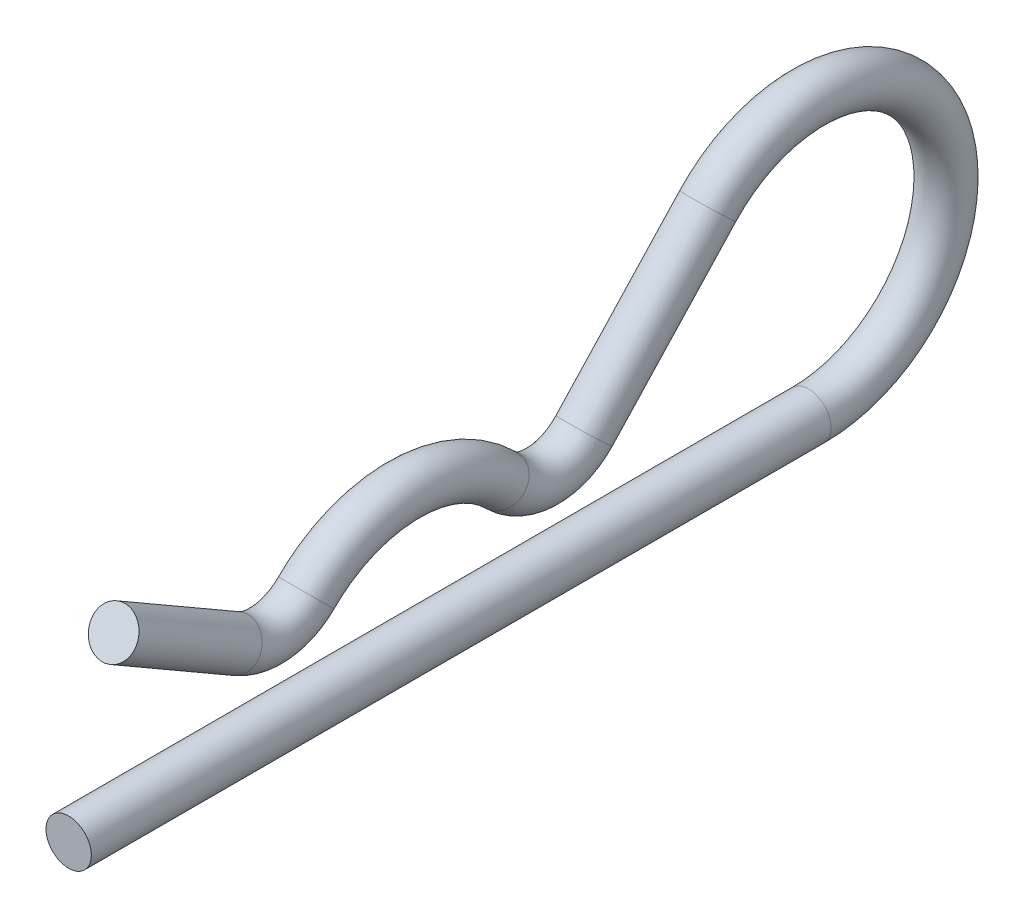
ISO-10303-21;
HEADER;
FILE_DESCRIPTION(('STEP AP214'),'2;1');
FILE_NAME('part.step','',(''),(''),'','','');
FILE_SCHEMA(('AUTOMOTIVE_DESIGN { 1 0 10303 214 1 1 1 1 }'));
ENDSEC;
DATA;
#1=APPLICATION_CONTEXT('core data for automotive mechanical design processes');
#2=APPLICATION_PROTOCOL_DEFINITION('international standard','automotive_design',2000,#1);
#3=PRODUCT_CONTEXT('',#1,'mechanical');
#4=PRODUCT('Part','Part','',(#3));
#5=PRODUCT_RELATED_PRODUCT_CATEGORY('part','',(#4));
#6=PRODUCT_DEFINITION_FORMATION('','',#4);
#7=PRODUCT_DEFINITION_CONTEXT('part definition',#1,'design');
#8=PRODUCT_DEFINITION('design','',#6,#7);
#9=PRODUCT_DEFINITION_SHAPE('','',#8);
#10=(LENGTH_UNIT() NAMED_UNIT(*) SI_UNIT(.MILLI.,.METRE.));
#11=(NAMED_UNIT(*) PLANE_ANGLE_UNIT() SI_UNIT($,.RADIAN.));
#12=(NAMED_UNIT(*) SI_UNIT($,.STERADIAN.) SOLID_ANGLE_UNIT());
#13=UNCERTAINTY_MEASURE_WITH_UNIT(LENGTH_MEASURE(1.E-05),#10,'distance_accuracy_value','');
#14=(GEOMETRIC_REPRESENTATION_CONTEXT(3) GLOBAL_UNCERTAINTY_ASSIGNED_CONTEXT((#13)) GLOBAL_UNIT_ASSIGNED_CONTEXT((#10,
#11,#12)) REPRESENTATION_CONTEXT('',''));
#15=CARTESIAN_POINT('',(0.,0.,0.));
#16=DIRECTION('',(0.,0.,1.));
#17=DIRECTION('',(1.,0.,0.));
#18=AXIS2_PLACEMENT_3D('',#15,#16,#17);
#19=CARTESIAN_POINT('',(0.,-11.4046,37.30625));
#20=DIRECTION('',(0.,0.,1.));
#21=DIRECTION('',(1.,0.,0.));
#22=AXIS2_PLACEMENT_3D('',#19,#20,#21);
#23=PLANE('',#22);
#24=CARTESIAN_POINT('',(0.,-11.4046,37.30625));
#25=DIRECTION('',(0.,0.,1.));
#26=DIRECTION('',(1.,0.,0.));
#27=AXIS2_PLACEMENT_3D('',#24,#25,#26);
#28=CIRCLE('',#27,1.8796);
#29=CARTESIAN_POINT('',(1.8796,-11.4046,37.30625));
#30=VERTEX_POINT('',#29);
#31=EDGE_CURVE('E54',#30,#30,#28,.T.);
#32=ORIENTED_EDGE('',*,*,#31,.T.);
#33=EDGE_LOOP('',(#32));
#34=FACE_BOUND('',#33,.T.);
#35=ADVANCED_FACE('F41',(#34),#23,.T.);
#36=CARTESIAN_POINT('',(0.,1.77047796738838,33.575625));
#37=DIRECTION('',(0.,-0.499999999999991,-0.866025403784444));
#38=DIRECTION('',(1.,0.,0.));
#39=AXIS2_PLACEMENT_3D('',#36,#37,#38);
#40=PLANE('',#39);
#41=CARTESIAN_POINT('',(0.,1.77047796738838,33.575625));
#42=DIRECTION('',(0.,-0.499999999999991,-0.866025403784444));
#43=DIRECTION('',(1.,0.,0.));
#44=AXIS2_PLACEMENT_3D('',#41,#42,#43);
#45=CIRCLE('',#44,1.8796);
#46=CARTESIAN_POINT('',(1.8796,1.77047796738838,33.575625));
#47=VERTEX_POINT('',#46);
#48=EDGE_CURVE('E11',#47,#47,#45,.T.);
#49=ORIENTED_EDGE('',*,*,#48,.F.);
#50=EDGE_LOOP('',(#49));
#51=FACE_BOUND('',#50,.T.);
#52=ADVANCED_FACE('F60',(#51),#40,.F.);
#53=CARTESIAN_POINT('',(0.,-11.4046,37.30625));
#54=DIRECTION('',(0.,0.,-1.));
#55=DIRECTION('',(-1.,0.,0.));
#56=AXIS2_PLACEMENT_3D('',#53,#54,#55);
#57=CYLINDRICAL_SURFACE('',#56,1.8796);
#58=CARTESIAN_POINT('',(0.,-11.4046,-24.02205));
#59=DIRECTION('',(0.,0.,1.));
#60=DIRECTION('',(1.,0.,0.));
#61=AXIS2_PLACEMENT_3D('',#58,#59,#60);
#62=CIRCLE('',#61,1.8796);
#63=CARTESIAN_POINT('',(0.,-13.2842,-24.02205));
#64=VERTEX_POINT('',#63);
#65=EDGE_CURVE('E102',#64,#64,#62,.T.);
#66=ORIENTED_EDGE('',*,*,#65,.T.);
#67=EDGE_LOOP('',(#66));
#68=FACE_BOUND('',#67,.T.);
#69=ORIENTED_EDGE('',*,*,#31,.F.);
#70=EDGE_LOOP('',(#69));
#71=FACE_BOUND('',#70,.T.);
#72=ADVANCED_FACE('F62',(#68,#71),#57,.T.);
#73=CARTESIAN_POINT('',(0.,0.,-24.02205));
#74=DIRECTION('',(1.,0.,0.));
#75=DIRECTION('',(0.,0.,-1.));
#76=AXIS2_PLACEMENT_3D('',#73,#74,#75);
#77=TOROIDAL_SURFACE('',#76,11.4046,1.8796);
#78=CARTESIAN_POINT('',(0.,7.7707297878351,-15.674555781706));
#79=DIRECTION('',(0.,0.73194099032794,-0.681368025869834));
#80=DIRECTION('',(1.,0.,0.));
#81=AXIS2_PLACEMENT_3D('',#78,#79,#80);
#82=CIRCLE('',#81,1.8796);
#83=CARTESIAN_POINT('',(0.,9.05142912926005,-14.2987994962856));
#84=VERTEX_POINT('',#83);
#85=EDGE_CURVE('E99',#84,#84,#82,.T.);
#86=CARTESIAN_POINT('',(0.,0.,-24.02205));
#87=DIRECTION('',(1.,0.,0.));
#88=DIRECTION('',(0.,0.,-1.));
#89=AXIS2_PLACEMENT_3D('',#86,#87,#88);
#90=CIRCLE('',#89,13.2842);
#91=EDGE_CURVE('',#64,#84,#90,.T.);
#92=ORIENTED_EDGE('',*,*,#65,.F.);
#93=ORIENTED_EDGE('',*,*,#85,.T.);
#94=ORIENTED_EDGE('',*,*,#91,.T.);
#95=ORIENTED_EDGE('',*,*,#91,.F.);
#96=EDGE_LOOP('',(#92,#94,#93,#95));
#97=FACE_BOUND('',#96,.T.);
#98=ADVANCED_FACE('F67',(#97),#77,.T.);
#99=CARTESIAN_POINT('',(0.,7.7707297878351,-15.674555781706));
#100=DIRECTION('',(0.,-0.73194099032794,0.681368025869834));
#101=DIRECTION('',(0.,-0.681368025869834,-0.73194099032794));
#102=AXIS2_PLACEMENT_3D('',#99,#100,#101);
#103=CYLINDRICAL_SURFACE('',#102,1.8796);
#104=CARTESIAN_POINT('',(0.,-3.24501522320509,-5.4199361732386));
#105=DIRECTION('',(0.,0.73194099032794,-0.681368025869834));
#106=DIRECTION('',(1.,0.,0.));
#107=AXIS2_PLACEMENT_3D('',#104,#105,#106);
#108=CIRCLE('',#107,1.8796);
#109=CARTESIAN_POINT('',(0.,-4.52571456463003,-6.79569245865899));
#110=VERTEX_POINT('',#109);
#111=EDGE_CURVE('E108',#110,#110,#108,.T.);
#112=ORIENTED_EDGE('',*,*,#111,.T.);
#113=EDGE_LOOP('',(#112));
#114=FACE_BOUND('',#113,.T.);
#115=ORIENTED_EDGE('',*,*,#85,.F.);
#116=EDGE_LOOP('',(#115));
#117=FACE_BOUND('',#116,.T.);
#118=ADVANCED_FACE('F87',(#114,#117),#103,.T.);
#119=CARTESIAN_POINT('',(0.,0.,-1.93406720680178));
#120=DIRECTION('',(-1.,0.,0.));
#121=DIRECTION('',(0.,0.,1.));
#122=AXIS2_PLACEMENT_3D('',#119,#120,#121);
#123=TOROIDAL_SURFACE('',#122,4.76249999999999,1.8796);
#124=CARTESIAN_POINT('',(0.,-3.3595640219953,1.44154175042576));
#125=DIRECTION('',(0.,-0.70878928235749,-0.705420267085625));
#126=DIRECTION('',(1.,0.,0.));
#127=AXIS2_PLACEMENT_3D('',#124,#125,#126);
#128=CIRCLE('',#127,1.8796);
#129=CARTESIAN_POINT('',(0.,-4.68547195600944,2.7737820855449));
#130=VERTEX_POINT('',#129);
#131=EDGE_CURVE('E115',#130,#130,#128,.T.);
#132=CARTESIAN_POINT('',(0.,0.,-1.93406720680178));
#133=DIRECTION('',(-1.,0.,0.));
#134=DIRECTION('',(0.,0.,1.));
#135=AXIS2_PLACEMENT_3D('',#132,#133,#134);
#136=CIRCLE('',#135,6.6421);
#137=EDGE_CURVE('',#110,#130,#136,.T.);
#138=ORIENTED_EDGE('',*,*,#111,.F.);
#139=ORIENTED_EDGE('',*,*,#131,.T.);
#140=ORIENTED_EDGE('',*,*,#137,.T.);
#141=ORIENTED_EDGE('',*,*,#137,.F.);
#142=EDGE_LOOP('',(#138,#140,#139,#141));
#143=FACE_BOUND('',#142,.T.);
#144=ADVANCED_FACE('F83',(#143),#123,.T.);
#145=CARTESIAN_POINT('',(0.,-11.4046,9.525));
#146=DIRECTION('',(1.,0.,0.));
#147=DIRECTION('',(0.,0.,-1.));
#148=AXIS2_PLACEMENT_3D('',#145,#146,#147);
#149=TOROIDAL_SURFACE('',#148,11.4046,1.8796);
#150=CARTESIAN_POINT('',(0.,-3.3595640219953,17.6084582495742));
#151=DIRECTION('',(0.,0.70878928235749,-0.705420267085625));
#152=DIRECTION('',(1.,0.,0.));
#153=AXIS2_PLACEMENT_3D('',#150,#151,#152);
#154=CIRCLE('',#153,1.8796);
#155=CARTESIAN_POINT('',(0.,-4.68547195600944,16.2762179144551));
#156=VERTEX_POINT('',#155);
#157=EDGE_CURVE('E119',#156,#156,#154,.T.);
#158=ORIENTED_EDGE('',*,*,#157,.T.);
#159=EDGE_LOOP('',(#158));
#160=FACE_BOUND('',#159,.T.);
#161=ORIENTED_EDGE('',*,*,#131,.F.);
#162=EDGE_LOOP('',(#161));
#163=FACE_BOUND('',#162,.T.);
#164=ADVANCED_FACE('F77',(#160,#163),#149,.T.);
#165=CARTESIAN_POINT('',(0.,0.,20.9840672068018));
#166=DIRECTION('',(-1.,0.,0.));
#167=DIRECTION('',(0.,0.,1.));
#168=AXIS2_PLACEMENT_3D('',#165,#166,#167);
#169=TOROIDAL_SURFACE('',#168,4.76249999999999,1.8796);
#170=CARTESIAN_POINT('',(0.,-4.12444598552343,23.3653172068017));
#171=DIRECTION('',(0.,-0.499999999999991,-0.866025403784444));
#172=DIRECTION('',(1.,0.,0.));
#173=AXIS2_PLACEMENT_3D('',#170,#171,#172);
#174=CIRCLE('',#173,1.8796);
#175=CARTESIAN_POINT('',(0.,-5.75222733447666,24.3051172068017));
#176=VERTEX_POINT('',#175);
#177=EDGE_CURVE('E49',#176,#176,#174,.T.);
#178=CARTESIAN_POINT('',(0.,0.,20.9840672068018));
#179=DIRECTION('',(-1.,0.,0.));
#180=DIRECTION('',(0.,0.,1.));
#181=AXIS2_PLACEMENT_3D('',#178,#179,#180);
#182=CIRCLE('',#181,6.64209999999999);
#183=EDGE_CURVE('',#156,#176,#182,.T.);
#184=ORIENTED_EDGE('',*,*,#157,.F.);
#185=ORIENTED_EDGE('',*,*,#177,.T.);
#186=ORIENTED_EDGE('',*,*,#183,.T.);
#187=ORIENTED_EDGE('',*,*,#183,.F.);
#188=EDGE_LOOP('',(#184,#186,#185,#187));
#189=FACE_BOUND('',#188,.T.);
#190=ADVANCED_FACE('F73',(#189),#169,.T.);
#191=CARTESIAN_POINT('',(0.,-4.12444598552343,23.3653172068017));
#192=DIRECTION('',(0.,0.499999999999991,0.866025403784444));
#193=DIRECTION('',(0.,-0.866025403784444,0.499999999999991));
#194=AXIS2_PLACEMENT_3D('',#191,#192,#193);
#195=CYLINDRICAL_SURFACE('',#194,1.8796);
#196=ORIENTED_EDGE('',*,*,#48,.T.);
#197=EDGE_LOOP('',(#196));
#198=FACE_BOUND('',#197,.T.);
#199=ORIENTED_EDGE('',*,*,#177,.F.);
#200=EDGE_LOOP('',(#199));
#201=FACE_BOUND('',#200,.T.);
#202=ADVANCED_FACE('F57',(#198,#201),#195,.T.);
#203=CLOSED_SHELL('',(#35,#52,#72,#98,#118,#144,#164,#190,#202));
#204=MANIFOLD_SOLID_BREP('B2',#203);
#205=ADVANCED_BREP_SHAPE_REPRESENTATION('',(#18,#204),#14);
#206=SHAPE_DEFINITION_REPRESENTATION(#9,#205);
ENDSEC;
END-ISO-10303-21;
